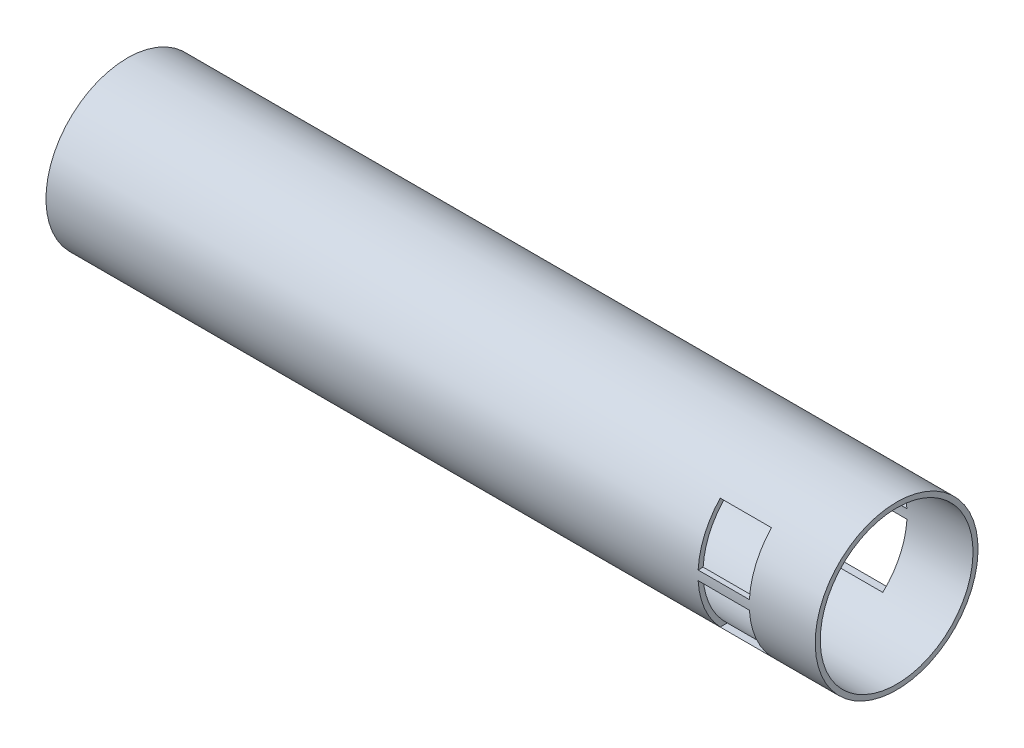
ISO-10303-21;
HEADER;
FILE_DESCRIPTION(('STEP AP214'),'2;1');
FILE_NAME('part.step','',(''),(''),'','','');
FILE_SCHEMA(('AUTOMOTIVE_DESIGN { 1 0 10303 214 1 1 1 1 }'));
ENDSEC;
DATA;
#1=APPLICATION_CONTEXT('core data for automotive mechanical design processes');
#2=APPLICATION_PROTOCOL_DEFINITION('international standard','automotive_design',2000,#1);
#3=PRODUCT_CONTEXT('',#1,'mechanical');
#4=PRODUCT('Part','Part','',(#3));
#5=PRODUCT_RELATED_PRODUCT_CATEGORY('part','',(#4));
#6=PRODUCT_DEFINITION_FORMATION('','',#4);
#7=PRODUCT_DEFINITION_CONTEXT('part definition',#1,'design');
#8=PRODUCT_DEFINITION('design','',#6,#7);
#9=PRODUCT_DEFINITION_SHAPE('','',#8);
#10=(LENGTH_UNIT() NAMED_UNIT(*) SI_UNIT(.MILLI.,.METRE.));
#11=(NAMED_UNIT(*) PLANE_ANGLE_UNIT() SI_UNIT($,.RADIAN.));
#12=(NAMED_UNIT(*) SI_UNIT($,.STERADIAN.) SOLID_ANGLE_UNIT());
#13=UNCERTAINTY_MEASURE_WITH_UNIT(LENGTH_MEASURE(1.E-05),#10,'distance_accuracy_value','');
#14=(GEOMETRIC_REPRESENTATION_CONTEXT(3) GLOBAL_UNCERTAINTY_ASSIGNED_CONTEXT((#13)) GLOBAL_UNIT_ASSIGNED_CONTEXT((#10,
#11,#12)) REPRESENTATION_CONTEXT('',''));
#15=CARTESIAN_POINT('',(0.,0.,0.));
#16=DIRECTION('',(0.,0.,1.));
#17=DIRECTION('',(1.,0.,0.));
#18=AXIS2_PLACEMENT_3D('',#15,#16,#17);
#19=CARTESIAN_POINT('',(210.,0.,0.));
#20=DIRECTION('',(-1.,0.,0.));
#21=DIRECTION('',(0.,-1.,0.));
#22=AXIS2_PLACEMENT_3D('',#19,#20,#21);
#23=CYLINDRICAL_SURFACE('',#22,41.7068);
#24=CARTESIAN_POINT('',(210.,0.,0.));
#25=DIRECTION('',(1.,0.,0.));
#26=DIRECTION('',(0.,1.,0.));
#27=AXIS2_PLACEMENT_3D('',#24,#25,#26);
#28=CIRCLE('',#27,41.7068);
#29=CARTESIAN_POINT('',(210.,41.7068000000001,0.));
#30=VERTEX_POINT('',#29);
#31=EDGE_CURVE('E223',#30,#30,#28,.T.);
#32=ORIENTED_EDGE('',*,*,#31,.T.);
#33=EDGE_LOOP('',(#32));
#34=FACE_BOUND('',#33,.T.);
#35=CARTESIAN_POINT('',(-210.,0.,0.));
#36=DIRECTION('',(1.,0.,0.));
#37=DIRECTION('',(0.,1.,0.));
#38=AXIS2_PLACEMENT_3D('',#35,#36,#37);
#39=CIRCLE('',#38,41.7068);
#40=CARTESIAN_POINT('',(-210.,41.7067999999999,0.));
#41=VERTEX_POINT('',#40);
#42=EDGE_CURVE('E231',#41,#41,#39,.T.);
#43=ORIENTED_EDGE('',*,*,#42,.F.);
#44=EDGE_LOOP('',(#43));
#45=FACE_BOUND('',#44,.T.);
#46=DIRECTION('',(-1.,0.,0.));
#47=VECTOR('',#46,1.);
#48=CARTESIAN_POINT('',(210.,-30.5,28.4465668621012));
#49=LINE('',#48,#47);
#50=CARTESIAN_POINT('',(146.,-30.5,28.4465668621012));
#51=VERTEX_POINT('',#50);
#52=CARTESIAN_POINT('',(174.,-30.5,28.4465668621012));
#53=VERTEX_POINT('',#52);
#54=EDGE_CURVE('E163',#51,#53,#49,.F.);
#55=ORIENTED_EDGE('',*,*,#54,.T.);
#56=CARTESIAN_POINT('',(174.,0.,0.));
#57=DIRECTION('',(-1.,0.,0.));
#58=DIRECTION('',(0.,0.,1.));
#59=AXIS2_PLACEMENT_3D('',#56,#57,#58);
#60=CIRCLE('',#59,41.7068);
#61=CARTESIAN_POINT('',(174.,-2.50000000000002,41.6318047439695));
#62=VERTEX_POINT('',#61);
#63=EDGE_CURVE('E200',#53,#62,#60,.T.);
#64=ORIENTED_EDGE('',*,*,#63,.T.);
#65=DIRECTION('',(-1.,0.,0.));
#66=VECTOR('',#65,1.);
#67=CARTESIAN_POINT('',(210.,-2.50000000000002,41.6318047439695));
#68=LINE('',#67,#66);
#69=CARTESIAN_POINT('',(146.,-2.50000000000002,41.6318047439695));
#70=VERTEX_POINT('',#69);
#71=EDGE_CURVE('E190',#62,#70,#68,.T.);
#72=ORIENTED_EDGE('',*,*,#71,.T.);
#73=CARTESIAN_POINT('',(146.,0.,0.));
#74=DIRECTION('',(1.,0.,0.));
#75=DIRECTION('',(0.,0.,-1.));
#76=AXIS2_PLACEMENT_3D('',#73,#74,#75);
#77=CIRCLE('',#76,41.7068);
#78=EDGE_CURVE('E180',#70,#51,#77,.T.);
#79=ORIENTED_EDGE('',*,*,#78,.T.);
#80=EDGE_LOOP('',(#55,#64,#72,#79));
#81=FACE_BOUND('',#80,.T.);
#82=DIRECTION('',(-1.,0.,0.));
#83=VECTOR('',#82,1.);
#84=CARTESIAN_POINT('',(210.,-2.50000000000002,-41.6318047439695));
#85=LINE('',#84,#83);
#86=CARTESIAN_POINT('',(146.,-2.50000000000002,-41.6318047439695));
#87=VERTEX_POINT('',#86);
#88=CARTESIAN_POINT('',(174.,-2.50000000000002,-41.6318047439695));
#89=VERTEX_POINT('',#88);
#90=EDGE_CURVE('E191',#87,#89,#85,.F.);
#91=ORIENTED_EDGE('',*,*,#90,.T.);
#92=CARTESIAN_POINT('',(174.,-30.5,-28.4465668621012));
#93=VERTEX_POINT('',#92);
#94=EDGE_CURVE('E202',#89,#93,#60,.T.);
#95=ORIENTED_EDGE('',*,*,#94,.T.);
#96=DIRECTION('',(-1.,0.,0.));
#97=VECTOR('',#96,1.);
#98=CARTESIAN_POINT('',(210.,-30.5,-28.4465668621012));
#99=LINE('',#98,#97);
#100=CARTESIAN_POINT('',(146.,-30.5,-28.4465668621012));
#101=VERTEX_POINT('',#100);
#102=EDGE_CURVE('E174',#93,#101,#99,.T.);
#103=ORIENTED_EDGE('',*,*,#102,.T.);
#104=EDGE_CURVE('E192',#101,#87,#77,.T.);
#105=ORIENTED_EDGE('',*,*,#104,.T.);
#106=EDGE_LOOP('',(#91,#95,#103,#105));
#107=FACE_BOUND('',#106,.T.);
#108=DIRECTION('',(-1.,0.,0.));
#109=VECTOR('',#108,1.);
#110=CARTESIAN_POINT('',(210.,2.5,41.6318047439695));
#111=LINE('',#110,#109);
#112=CARTESIAN_POINT('',(146.,2.5,41.6318047439695));
#113=VERTEX_POINT('',#112);
#114=CARTESIAN_POINT('',(174.,2.49999999999999,41.6318047439695));
#115=VERTEX_POINT('',#114);
#116=EDGE_CURVE('E203',#113,#115,#111,.F.);
#117=ORIENTED_EDGE('',*,*,#116,.T.);
#118=CARTESIAN_POINT('',(174.,0.,0.));
#119=DIRECTION('',(-1.,0.,0.));
#120=DIRECTION('',(0.,0.,1.));
#121=AXIS2_PLACEMENT_3D('',#118,#119,#120);
#122=CIRCLE('',#121,41.7068);
#123=CARTESIAN_POINT('',(174.,30.5,28.4465668621014));
#124=VERTEX_POINT('',#123);
#125=EDGE_CURVE('E222',#115,#124,#122,.T.);
#126=ORIENTED_EDGE('',*,*,#125,.T.);
#127=DIRECTION('',(-1.,0.,0.));
#128=VECTOR('',#127,1.);
#129=CARTESIAN_POINT('',(210.,30.5,28.4465668621014));
#130=LINE('',#129,#128);
#131=CARTESIAN_POINT('',(146.,30.5,28.4465668621014));
#132=VERTEX_POINT('',#131);
#133=EDGE_CURVE('E216',#124,#132,#130,.T.);
#134=ORIENTED_EDGE('',*,*,#133,.T.);
#135=CARTESIAN_POINT('',(146.,0.,0.));
#136=DIRECTION('',(1.,0.,0.));
#137=DIRECTION('',(0.,0.,-1.));
#138=AXIS2_PLACEMENT_3D('',#135,#136,#137);
#139=CIRCLE('',#138,41.7068);
#140=EDGE_CURVE('E209',#132,#113,#139,.T.);
#141=ORIENTED_EDGE('',*,*,#140,.T.);
#142=EDGE_LOOP('',(#117,#126,#134,#141));
#143=FACE_BOUND('',#142,.T.);
#144=DIRECTION('',(-1.,0.,0.));
#145=VECTOR('',#144,1.);
#146=CARTESIAN_POINT('',(210.,30.5,-28.4465668621014));
#147=LINE('',#146,#145);
#148=CARTESIAN_POINT('',(146.,30.5,-28.4465668621014));
#149=VERTEX_POINT('',#148);
#150=CARTESIAN_POINT('',(174.,30.5,-28.4465668621013));
#151=VERTEX_POINT('',#150);
#152=EDGE_CURVE('E213',#149,#151,#147,.F.);
#153=ORIENTED_EDGE('',*,*,#152,.T.);
#154=CARTESIAN_POINT('',(174.,2.5,-41.6318047439695));
#155=VERTEX_POINT('',#154);
#156=EDGE_CURVE('E219',#151,#155,#122,.T.);
#157=ORIENTED_EDGE('',*,*,#156,.T.);
#158=DIRECTION('',(-1.,0.,0.));
#159=VECTOR('',#158,1.);
#160=CARTESIAN_POINT('',(210.,2.5,-41.6318047439695));
#161=LINE('',#160,#159);
#162=CARTESIAN_POINT('',(146.,2.49999999999998,-41.6318047439695));
#163=VERTEX_POINT('',#162);
#164=EDGE_CURVE('E206',#155,#163,#161,.T.);
#165=ORIENTED_EDGE('',*,*,#164,.T.);
#166=EDGE_CURVE('E212',#163,#149,#139,.T.);
#167=ORIENTED_EDGE('',*,*,#166,.T.);
#168=EDGE_LOOP('',(#153,#157,#165,#167));
#169=FACE_BOUND('',#168,.T.);
#170=ADVANCED_FACE('F50',(#34,#45,#81,#107,#143,#169),#23,.F.);
#171=CARTESIAN_POINT('',(210.,0.,0.));
#172=DIRECTION('',(-1.,0.,0.));
#173=DIRECTION('',(0.,-1.,0.));
#174=AXIS2_PLACEMENT_3D('',#171,#172,#173);
#175=CYLINDRICAL_SURFACE('',#174,44.45);
#176=CARTESIAN_POINT('',(174.,0.,0.));
#177=DIRECTION('',(-1.,0.,0.));
#178=DIRECTION('',(0.,0.,1.));
#179=AXIS2_PLACEMENT_3D('',#176,#177,#178);
#180=CIRCLE('',#179,44.45);
#181=CARTESIAN_POINT('',(174.,2.5,44.3796406024204));
#182=VERTEX_POINT('',#181);
#183=CARTESIAN_POINT('',(174.,30.5,32.3350042523579));
#184=VERTEX_POINT('',#183);
#185=EDGE_CURVE('E59',#182,#184,#180,.T.);
#186=ORIENTED_EDGE('',*,*,#185,.F.);
#187=DIRECTION('',(-1.,0.,0.));
#188=VECTOR('',#187,1.);
#189=CARTESIAN_POINT('',(210.,2.5,44.3796406024204));
#190=LINE('',#189,#188);
#191=CARTESIAN_POINT('',(146.,2.49999999999998,44.3796406024204));
#192=VERTEX_POINT('',#191);
#193=EDGE_CURVE('E248',#192,#182,#190,.F.);
#194=ORIENTED_EDGE('',*,*,#193,.F.);
#195=CARTESIAN_POINT('',(146.,0.,0.));
#196=DIRECTION('',(1.,0.,0.));
#197=DIRECTION('',(0.,0.,-1.));
#198=AXIS2_PLACEMENT_3D('',#195,#196,#197);
#199=CIRCLE('',#198,44.45);
#200=CARTESIAN_POINT('',(146.,30.5,32.3350042523579));
#201=VERTEX_POINT('',#200);
#202=EDGE_CURVE('E250',#201,#192,#199,.T.);
#203=ORIENTED_EDGE('',*,*,#202,.F.);
#204=DIRECTION('',(-1.,0.,0.));
#205=VECTOR('',#204,1.);
#206=CARTESIAN_POINT('',(210.,30.5,32.3350042523579));
#207=LINE('',#206,#205);
#208=EDGE_CURVE('E253',#184,#201,#207,.T.);
#209=ORIENTED_EDGE('',*,*,#208,.F.);
#210=EDGE_LOOP('',(#186,#194,#203,#209));
#211=FACE_BOUND('',#210,.T.);
#212=CARTESIAN_POINT('',(174.,0.,0.));
#213=DIRECTION('',(-1.,0.,0.));
#214=DIRECTION('',(0.,0.,1.));
#215=AXIS2_PLACEMENT_3D('',#212,#213,#214);
#216=CIRCLE('',#215,44.45);
#217=CARTESIAN_POINT('',(174.,-30.5,32.3350042523578));
#218=VERTEX_POINT('',#217);
#219=CARTESIAN_POINT('',(174.,-2.50000000000002,44.3796406024204));
#220=VERTEX_POINT('',#219);
#221=EDGE_CURVE('E241',#218,#220,#216,.T.);
#222=ORIENTED_EDGE('',*,*,#221,.F.);
#223=DIRECTION('',(-1.,0.,0.));
#224=VECTOR('',#223,1.);
#225=CARTESIAN_POINT('',(210.,-30.5,32.3350042523578));
#226=LINE('',#225,#224);
#227=CARTESIAN_POINT('',(146.,-30.5,32.3350042523578));
#228=VERTEX_POINT('',#227);
#229=EDGE_CURVE('E230',#228,#218,#226,.F.);
#230=ORIENTED_EDGE('',*,*,#229,.F.);
#231=CARTESIAN_POINT('',(146.,0.,0.));
#232=DIRECTION('',(1.,0.,0.));
#233=DIRECTION('',(0.,0.,-1.));
#234=AXIS2_PLACEMENT_3D('',#231,#232,#233);
#235=CIRCLE('',#234,44.45);
#236=CARTESIAN_POINT('',(146.,-2.50000000000002,44.3796406024204));
#237=VERTEX_POINT('',#236);
#238=EDGE_CURVE('E183',#237,#228,#235,.T.);
#239=ORIENTED_EDGE('',*,*,#238,.F.);
#240=DIRECTION('',(-1.,0.,0.));
#241=VECTOR('',#240,1.);
#242=CARTESIAN_POINT('',(210.,-2.50000000000002,44.3796406024204));
#243=LINE('',#242,#241);
#244=EDGE_CURVE('E238',#220,#237,#243,.T.);
#245=ORIENTED_EDGE('',*,*,#244,.F.);
#246=EDGE_LOOP('',(#222,#230,#239,#245));
#247=FACE_BOUND('',#246,.T.);
#248=CARTESIAN_POINT('',(210.,0.,0.));
#249=DIRECTION('',(1.,0.,0.));
#250=DIRECTION('',(0.,1.,0.));
#251=AXIS2_PLACEMENT_3D('',#248,#249,#250);
#252=CIRCLE('',#251,44.45);
#253=CARTESIAN_POINT('',(210.,44.4500000000001,0.));
#254=VERTEX_POINT('',#253);
#255=EDGE_CURVE('E226',#254,#254,#252,.T.);
#256=ORIENTED_EDGE('',*,*,#255,.F.);
#257=EDGE_LOOP('',(#256));
#258=FACE_BOUND('',#257,.T.);
#259=CARTESIAN_POINT('',(-210.,0.,0.));
#260=DIRECTION('',(1.,0.,0.));
#261=DIRECTION('',(0.,1.,0.));
#262=AXIS2_PLACEMENT_3D('',#259,#260,#261);
#263=CIRCLE('',#262,44.45);
#264=CARTESIAN_POINT('',(-210.,44.4499999999999,0.));
#265=VERTEX_POINT('',#264);
#266=EDGE_CURVE('E227',#265,#265,#263,.T.);
#267=ORIENTED_EDGE('',*,*,#266,.T.);
#268=EDGE_LOOP('',(#267));
#269=FACE_BOUND('',#268,.T.);
#270=CARTESIAN_POINT('',(174.,-2.50000000000002,-44.3796406024204));
#271=VERTEX_POINT('',#270);
#272=CARTESIAN_POINT('',(174.,-30.5,-32.3350042523578));
#273=VERTEX_POINT('',#272);
#274=EDGE_CURVE('E244',#271,#273,#216,.T.);
#275=ORIENTED_EDGE('',*,*,#274,.F.);
#276=DIRECTION('',(-1.,0.,0.));
#277=VECTOR('',#276,1.);
#278=CARTESIAN_POINT('',(210.,-2.50000000000002,-44.3796406024204));
#279=LINE('',#278,#277);
#280=CARTESIAN_POINT('',(146.,-2.50000000000002,-44.3796406024204));
#281=VERTEX_POINT('',#280);
#282=EDGE_CURVE('E246',#281,#271,#279,.F.);
#283=ORIENTED_EDGE('',*,*,#282,.F.);
#284=CARTESIAN_POINT('',(146.,-30.5,-32.3350042523577));
#285=VERTEX_POINT('',#284);
#286=EDGE_CURVE('E239',#285,#281,#235,.T.);
#287=ORIENTED_EDGE('',*,*,#286,.F.);
#288=DIRECTION('',(-1.,0.,0.));
#289=VECTOR('',#288,1.);
#290=CARTESIAN_POINT('',(210.,-30.5,-32.3350042523578));
#291=LINE('',#290,#289);
#292=EDGE_CURVE('E243',#273,#285,#291,.T.);
#293=ORIENTED_EDGE('',*,*,#292,.F.);
#294=EDGE_LOOP('',(#275,#283,#287,#293));
#295=FACE_BOUND('',#294,.T.);
#296=CARTESIAN_POINT('',(174.,30.5,-32.3350042523579));
#297=VERTEX_POINT('',#296);
#298=CARTESIAN_POINT('',(174.,2.49999999999999,-44.3796406024204));
#299=VERTEX_POINT('',#298);
#300=EDGE_CURVE('E12',#297,#299,#180,.T.);
#301=ORIENTED_EDGE('',*,*,#300,.F.);
#302=DIRECTION('',(-1.,0.,0.));
#303=VECTOR('',#302,1.);
#304=CARTESIAN_POINT('',(210.,30.5,-32.3350042523579));
#305=LINE('',#304,#303);
#306=CARTESIAN_POINT('',(146.,30.5,-32.3350042523579));
#307=VERTEX_POINT('',#306);
#308=EDGE_CURVE('E53',#307,#297,#305,.F.);
#309=ORIENTED_EDGE('',*,*,#308,.F.);
#310=CARTESIAN_POINT('',(146.,2.5,-44.3796406024204));
#311=VERTEX_POINT('',#310);
#312=EDGE_CURVE('E254',#311,#307,#199,.T.);
#313=ORIENTED_EDGE('',*,*,#312,.F.);
#314=DIRECTION('',(-1.,0.,0.));
#315=VECTOR('',#314,1.);
#316=CARTESIAN_POINT('',(210.,2.5,-44.3796406024204));
#317=LINE('',#316,#315);
#318=EDGE_CURVE('E255',#299,#311,#317,.T.);
#319=ORIENTED_EDGE('',*,*,#318,.F.);
#320=EDGE_LOOP('',(#301,#309,#313,#319));
#321=FACE_BOUND('',#320,.T.);
#322=ADVANCED_FACE('F275',(#211,#247,#258,#269,#295,#321),#175,.T.);
#323=CARTESIAN_POINT('',(210.,0.,0.));
#324=DIRECTION('',(1.,0.,0.));
#325=DIRECTION('',(0.,1.,0.));
#326=AXIS2_PLACEMENT_3D('',#323,#324,#325);
#327=PLANE('',#326);
#328=ORIENTED_EDGE('',*,*,#31,.F.);
#329=EDGE_LOOP('',(#328));
#330=FACE_BOUND('',#329,.T.);
#331=ORIENTED_EDGE('',*,*,#255,.T.);
#332=EDGE_LOOP('',(#331));
#333=FACE_BOUND('',#332,.T.);
#334=ADVANCED_FACE('F277',(#330,#333),#327,.T.);
#335=CARTESIAN_POINT('',(-210.,0.,0.));
#336=DIRECTION('',(1.,0.,0.));
#337=DIRECTION('',(0.,1.,0.));
#338=AXIS2_PLACEMENT_3D('',#335,#336,#337);
#339=PLANE('',#338);
#340=ORIENTED_EDGE('',*,*,#42,.T.);
#341=EDGE_LOOP('',(#340));
#342=FACE_BOUND('',#341,.T.);
#343=ORIENTED_EDGE('',*,*,#266,.F.);
#344=EDGE_LOOP('',(#343));
#345=FACE_BOUND('',#344,.T.);
#346=ADVANCED_FACE('F283',(#342,#345),#339,.F.);
#347=CARTESIAN_POINT('',(146.,-30.5,50.));
#348=DIRECTION('',(0.,1.,0.));
#349=DIRECTION('',(0.,0.,1.));
#350=AXIS2_PLACEMENT_3D('',#347,#348,#349);
#351=PLANE('',#350);
#352=DIRECTION('',(0.,0.,-1.));
#353=VECTOR('',#352,1.);
#354=CARTESIAN_POINT('',(146.,-30.5,50.));
#355=LINE('',#354,#353);
#356=EDGE_CURVE('E166',#228,#51,#355,.T.);
#357=ORIENTED_EDGE('',*,*,#356,.F.);
#358=ORIENTED_EDGE('',*,*,#229,.T.);
#359=DIRECTION('',(0.,0.,-1.));
#360=VECTOR('',#359,1.);
#361=CARTESIAN_POINT('',(174.,-30.5,50.));
#362=LINE('',#361,#360);
#363=EDGE_CURVE('E169',#218,#53,#362,.T.);
#364=ORIENTED_EDGE('',*,*,#363,.T.);
#365=ORIENTED_EDGE('',*,*,#54,.F.);
#366=EDGE_LOOP('',(#357,#358,#364,#365));
#367=FACE_BOUND('',#366,.T.);
#368=ADVANCED_FACE('F165',(#367),#351,.T.);
#369=CARTESIAN_POINT('',(146.,-2.50000000000002,50.));
#370=DIRECTION('',(1.,0.,0.));
#371=DIRECTION('',(0.,0.,-1.));
#372=AXIS2_PLACEMENT_3D('',#369,#370,#371);
#373=PLANE('',#372);
#374=DIRECTION('',(0.,0.,-1.));
#375=VECTOR('',#374,1.);
#376=CARTESIAN_POINT('',(146.,-2.50000000000002,50.));
#377=LINE('',#376,#375);
#378=EDGE_CURVE('E351',#237,#70,#377,.T.);
#379=ORIENTED_EDGE('',*,*,#378,.F.);
#380=ORIENTED_EDGE('',*,*,#238,.T.);
#381=ORIENTED_EDGE('',*,*,#356,.T.);
#382=ORIENTED_EDGE('',*,*,#78,.F.);
#383=EDGE_LOOP('',(#379,#380,#381,#382));
#384=FACE_BOUND('',#383,.T.);
#385=ADVANCED_FACE('F179',(#384),#373,.T.);
#386=CARTESIAN_POINT('',(146.,-2.50000000000002,50.));
#387=DIRECTION('',(0.,-1.,0.));
#388=DIRECTION('',(0.,0.,-1.));
#389=AXIS2_PLACEMENT_3D('',#386,#387,#388);
#390=PLANE('',#389);
#391=DIRECTION('',(0.,0.,-1.));
#392=VECTOR('',#391,1.);
#393=CARTESIAN_POINT('',(174.,-2.50000000000002,50.));
#394=LINE('',#393,#392);
#395=EDGE_CURVE('E348',#220,#62,#394,.T.);
#396=ORIENTED_EDGE('',*,*,#395,.F.);
#397=ORIENTED_EDGE('',*,*,#244,.T.);
#398=ORIENTED_EDGE('',*,*,#378,.T.);
#399=ORIENTED_EDGE('',*,*,#71,.F.);
#400=EDGE_LOOP('',(#396,#397,#398,#399));
#401=FACE_BOUND('',#400,.T.);
#402=ADVANCED_FACE('F301',(#401),#390,.T.);
#403=CARTESIAN_POINT('',(174.,-2.50000000000002,50.));
#404=DIRECTION('',(-1.,0.,0.));
#405=DIRECTION('',(0.,0.,1.));
#406=AXIS2_PLACEMENT_3D('',#403,#404,#405);
#407=PLANE('',#406);
#408=ORIENTED_EDGE('',*,*,#363,.F.);
#409=ORIENTED_EDGE('',*,*,#221,.T.);
#410=ORIENTED_EDGE('',*,*,#395,.T.);
#411=ORIENTED_EDGE('',*,*,#63,.F.);
#412=EDGE_LOOP('',(#408,#409,#410,#411));
#413=FACE_BOUND('',#412,.T.);
#414=ADVANCED_FACE('F304',(#413),#407,.T.);
#415=EDGE_CURVE('E345',#89,#271,#394,.T.);
#416=ORIENTED_EDGE('',*,*,#415,.T.);
#417=ORIENTED_EDGE('',*,*,#274,.T.);
#418=EDGE_CURVE('E185',#93,#273,#362,.T.);
#419=ORIENTED_EDGE('',*,*,#418,.F.);
#420=ORIENTED_EDGE('',*,*,#94,.F.);
#421=EDGE_LOOP('',(#416,#417,#419,#420));
#422=FACE_BOUND('',#421,.T.);
#423=ADVANCED_FACE('F307',(#422),#407,.T.);
#424=EDGE_CURVE('E349',#87,#281,#377,.T.);
#425=ORIENTED_EDGE('',*,*,#424,.T.);
#426=ORIENTED_EDGE('',*,*,#282,.T.);
#427=ORIENTED_EDGE('',*,*,#415,.F.);
#428=ORIENTED_EDGE('',*,*,#90,.F.);
#429=EDGE_LOOP('',(#425,#426,#427,#428));
#430=FACE_BOUND('',#429,.T.);
#431=ADVANCED_FACE('F306',(#430),#390,.T.);
#432=EDGE_CURVE('E186',#101,#285,#355,.T.);
#433=ORIENTED_EDGE('',*,*,#432,.T.);
#434=ORIENTED_EDGE('',*,*,#286,.T.);
#435=ORIENTED_EDGE('',*,*,#424,.F.);
#436=ORIENTED_EDGE('',*,*,#104,.F.);
#437=EDGE_LOOP('',(#433,#434,#435,#436));
#438=FACE_BOUND('',#437,.T.);
#439=ADVANCED_FACE('F297',(#438),#373,.T.);
#440=ORIENTED_EDGE('',*,*,#418,.T.);
#441=ORIENTED_EDGE('',*,*,#292,.T.);
#442=ORIENTED_EDGE('',*,*,#432,.F.);
#443=ORIENTED_EDGE('',*,*,#102,.F.);
#444=EDGE_LOOP('',(#440,#441,#442,#443));
#445=FACE_BOUND('',#444,.T.);
#446=ADVANCED_FACE('F293',(#445),#351,.T.);
#447=CARTESIAN_POINT('',(146.,2.5,50.));
#448=DIRECTION('',(0.,1.,0.));
#449=DIRECTION('',(0.,0.,1.));
#450=AXIS2_PLACEMENT_3D('',#447,#448,#449);
#451=PLANE('',#450);
#452=DIRECTION('',(0.,0.,-1.));
#453=VECTOR('',#452,1.);
#454=CARTESIAN_POINT('',(146.,2.5,50.));
#455=LINE('',#454,#453);
#456=EDGE_CURVE('E333',#192,#113,#455,.T.);
#457=ORIENTED_EDGE('',*,*,#456,.F.);
#458=ORIENTED_EDGE('',*,*,#193,.T.);
#459=DIRECTION('',(0.,0.,-1.));
#460=VECTOR('',#459,1.);
#461=CARTESIAN_POINT('',(174.,2.5,50.));
#462=LINE('',#461,#460);
#463=EDGE_CURVE('E74',#182,#115,#462,.T.);
#464=ORIENTED_EDGE('',*,*,#463,.T.);
#465=ORIENTED_EDGE('',*,*,#116,.F.);
#466=EDGE_LOOP('',(#457,#458,#464,#465));
#467=FACE_BOUND('',#466,.T.);
#468=ADVANCED_FACE('F296',(#467),#451,.T.);
#469=CARTESIAN_POINT('',(146.,30.5,50.));
#470=DIRECTION('',(1.,0.,0.));
#471=DIRECTION('',(0.,0.,-1.));
#472=AXIS2_PLACEMENT_3D('',#469,#470,#471);
#473=PLANE('',#472);
#474=DIRECTION('',(0.,0.,-1.));
#475=VECTOR('',#474,1.);
#476=CARTESIAN_POINT('',(146.,30.5,50.));
#477=LINE('',#476,#475);
#478=EDGE_CURVE('E273',#201,#132,#477,.T.);
#479=ORIENTED_EDGE('',*,*,#478,.F.);
#480=ORIENTED_EDGE('',*,*,#202,.T.);
#481=ORIENTED_EDGE('',*,*,#456,.T.);
#482=ORIENTED_EDGE('',*,*,#140,.F.);
#483=EDGE_LOOP('',(#479,#480,#481,#482));
#484=FACE_BOUND('',#483,.T.);
#485=ADVANCED_FACE('F318',(#484),#473,.T.);
#486=CARTESIAN_POINT('',(146.,30.5,50.));
#487=DIRECTION('',(0.,-1.,0.));
#488=DIRECTION('',(0.,0.,-1.));
#489=AXIS2_PLACEMENT_3D('',#486,#487,#488);
#490=PLANE('',#489);
#491=DIRECTION('',(0.,0.,-1.));
#492=VECTOR('',#491,1.);
#493=CARTESIAN_POINT('',(174.,30.5,50.));
#494=LINE('',#493,#492);
#495=EDGE_CURVE('E175',#184,#124,#494,.T.);
#496=ORIENTED_EDGE('',*,*,#495,.F.);
#497=ORIENTED_EDGE('',*,*,#208,.T.);
#498=ORIENTED_EDGE('',*,*,#478,.T.);
#499=ORIENTED_EDGE('',*,*,#133,.F.);
#500=EDGE_LOOP('',(#496,#497,#498,#499));
#501=FACE_BOUND('',#500,.T.);
#502=ADVANCED_FACE('F314',(#501),#490,.T.);
#503=CARTESIAN_POINT('',(174.,30.5,50.));
#504=DIRECTION('',(-1.,0.,0.));
#505=DIRECTION('',(0.,0.,1.));
#506=AXIS2_PLACEMENT_3D('',#503,#504,#505);
#507=PLANE('',#506);
#508=ORIENTED_EDGE('',*,*,#463,.F.);
#509=ORIENTED_EDGE('',*,*,#185,.T.);
#510=ORIENTED_EDGE('',*,*,#495,.T.);
#511=ORIENTED_EDGE('',*,*,#125,.F.);
#512=EDGE_LOOP('',(#508,#509,#510,#511));
#513=FACE_BOUND('',#512,.T.);
#514=ADVANCED_FACE('F311',(#513),#507,.T.);
#515=EDGE_CURVE('E266',#151,#297,#494,.T.);
#516=ORIENTED_EDGE('',*,*,#515,.T.);
#517=ORIENTED_EDGE('',*,*,#300,.T.);
#518=EDGE_CURVE('E356',#155,#299,#462,.T.);
#519=ORIENTED_EDGE('',*,*,#518,.F.);
#520=ORIENTED_EDGE('',*,*,#156,.F.);
#521=EDGE_LOOP('',(#516,#517,#519,#520));
#522=FACE_BOUND('',#521,.T.);
#523=ADVANCED_FACE('F271',(#522),#507,.T.);
#524=EDGE_CURVE('E267',#149,#307,#477,.T.);
#525=ORIENTED_EDGE('',*,*,#524,.T.);
#526=ORIENTED_EDGE('',*,*,#308,.T.);
#527=ORIENTED_EDGE('',*,*,#515,.F.);
#528=ORIENTED_EDGE('',*,*,#152,.F.);
#529=EDGE_LOOP('',(#525,#526,#527,#528));
#530=FACE_BOUND('',#529,.T.);
#531=ADVANCED_FACE('F265',(#530),#490,.T.);
#532=EDGE_CURVE('E66',#163,#311,#455,.T.);
#533=ORIENTED_EDGE('',*,*,#532,.T.);
#534=ORIENTED_EDGE('',*,*,#312,.T.);
#535=ORIENTED_EDGE('',*,*,#524,.F.);
#536=ORIENTED_EDGE('',*,*,#166,.F.);
#537=EDGE_LOOP('',(#533,#534,#535,#536));
#538=FACE_BOUND('',#537,.T.);
#539=ADVANCED_FACE('F320',(#538),#473,.T.);
#540=ORIENTED_EDGE('',*,*,#518,.T.);
#541=ORIENTED_EDGE('',*,*,#318,.T.);
#542=ORIENTED_EDGE('',*,*,#532,.F.);
#543=ORIENTED_EDGE('',*,*,#164,.F.);
#544=EDGE_LOOP('',(#540,#541,#542,#543));
#545=FACE_BOUND('',#544,.T.);
#546=ADVANCED_FACE('F323',(#545),#451,.T.);
#547=CLOSED_SHELL('',(#170,#322,#334,#346,#368,#385,#402,#414,#423,#431,#439,#446,#468,#485,
#502,#514,#523,#531,#539,#546));
#548=MANIFOLD_SOLID_BREP('B2',#547);
#549=ADVANCED_BREP_SHAPE_REPRESENTATION('',(#18,#548),#14);
#550=SHAPE_DEFINITION_REPRESENTATION(#9,#549);
ENDSEC;
END-ISO-10303-21;
